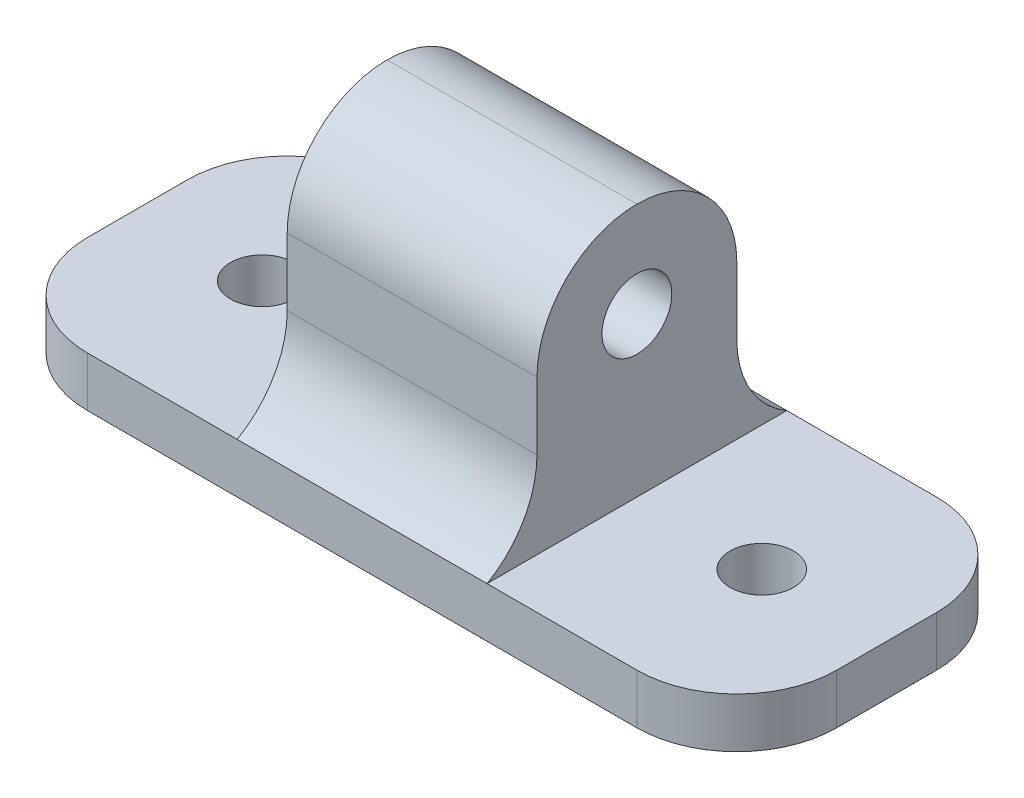
ISO-10303-21;
HEADER;
FILE_DESCRIPTION(('STEP AP214'),'2;1');
FILE_NAME('part.step','',(''),(''),'','','');
FILE_SCHEMA(('AUTOMOTIVE_DESIGN { 1 0 10303 214 1 1 1 1 }'));
ENDSEC;
DATA;
#1=APPLICATION_CONTEXT('core data for automotive mechanical design processes');
#2=APPLICATION_PROTOCOL_DEFINITION('international standard','automotive_design',2000,#1);
#3=PRODUCT_CONTEXT('',#1,'mechanical');
#4=PRODUCT('Part','Part','',(#3));
#5=PRODUCT_RELATED_PRODUCT_CATEGORY('part','',(#4));
#6=PRODUCT_DEFINITION_FORMATION('','',#4);
#7=PRODUCT_DEFINITION_CONTEXT('part definition',#1,'design');
#8=PRODUCT_DEFINITION('design','',#6,#7);
#9=PRODUCT_DEFINITION_SHAPE('','',#8);
#10=(LENGTH_UNIT() NAMED_UNIT(*) SI_UNIT(.MILLI.,.METRE.));
#11=(NAMED_UNIT(*) PLANE_ANGLE_UNIT() SI_UNIT($,.RADIAN.));
#12=(NAMED_UNIT(*) SI_UNIT($,.STERADIAN.) SOLID_ANGLE_UNIT());
#13=UNCERTAINTY_MEASURE_WITH_UNIT(LENGTH_MEASURE(1.E-05),#10,'distance_accuracy_value','');
#14=(GEOMETRIC_REPRESENTATION_CONTEXT(3) GLOBAL_UNCERTAINTY_ASSIGNED_CONTEXT((#13)) GLOBAL_UNIT_ASSIGNED_CONTEXT((#10,
#11,#12)) REPRESENTATION_CONTEXT('',''));
#15=CARTESIAN_POINT('',(0.,0.,0.));
#16=DIRECTION('',(0.,0.,1.));
#17=DIRECTION('',(1.,0.,0.));
#18=AXIS2_PLACEMENT_3D('',#15,#16,#17);
#19=CARTESIAN_POINT('',(0.,5.,0.));
#20=DIRECTION('',(0.,-1.,0.));
#21=DIRECTION('',(0.,0.,-1.));
#22=AXIS2_PLACEMENT_3D('',#19,#20,#21);
#23=PLANE('',#22);
#24=CARTESIAN_POINT('',(25.,5.,0.));
#25=DIRECTION('',(0.,1.,0.));
#26=DIRECTION('',(0.,0.,1.));
#27=AXIS2_PLACEMENT_3D('',#24,#25,#26);
#28=CIRCLE('',#27,3.17499999999999);
#29=CARTESIAN_POINT('',(25.,5.,3.17499999999999));
#30=VERTEX_POINT('',#29);
#31=EDGE_CURVE('E281',#30,#30,#28,.T.);
#32=ORIENTED_EDGE('',*,*,#31,.F.);
#33=EDGE_LOOP('',(#32));
#34=FACE_BOUND('',#33,.T.);
#35=DIRECTION('',(0.,0.,-1.));
#36=VECTOR('',#35,1.);
#37=CARTESIAN_POINT('',(12.5,5.,10.));
#38=LINE('',#37,#36);
#39=CARTESIAN_POINT('',(12.5,5.,15.));
#40=VERTEX_POINT('',#39);
#41=CARTESIAN_POINT('',(12.5,5.,-15.));
#42=VERTEX_POINT('',#41);
#43=EDGE_CURVE('E181',#40,#42,#38,.T.);
#44=ORIENTED_EDGE('',*,*,#43,.F.);
#45=DIRECTION('',(1.,0.,0.));
#46=VECTOR('',#45,1.);
#47=CARTESIAN_POINT('',(-37.5,5.,15.));
#48=LINE('',#47,#46);
#49=CARTESIAN_POINT('',(27.5,5.,15.));
#50=VERTEX_POINT('',#49);
#51=EDGE_CURVE('E255',#40,#50,#48,.T.);
#52=ORIENTED_EDGE('',*,*,#51,.T.);
#53=CARTESIAN_POINT('',(27.5,5.,5.));
#54=DIRECTION('',(0.,-1.,0.));
#55=DIRECTION('',(0.,0.,-1.));
#56=AXIS2_PLACEMENT_3D('',#53,#54,#55);
#57=CIRCLE('',#56,10.);
#58=CARTESIAN_POINT('',(37.5,5.,5.));
#59=VERTEX_POINT('',#58);
#60=EDGE_CURVE('E194',#50,#59,#57,.F.);
#61=ORIENTED_EDGE('',*,*,#60,.T.);
#62=DIRECTION('',(0.,0.,-1.));
#63=VECTOR('',#62,1.);
#64=CARTESIAN_POINT('',(37.5,5.,15.));
#65=LINE('',#64,#63);
#66=CARTESIAN_POINT('',(37.5,5.,-5.));
#67=VERTEX_POINT('',#66);
#68=EDGE_CURVE('E172',#59,#67,#65,.T.);
#69=ORIENTED_EDGE('',*,*,#68,.T.);
#70=CARTESIAN_POINT('',(27.5,5.,-5.));
#71=DIRECTION('',(0.,-1.,0.));
#72=DIRECTION('',(0.,0.,-1.));
#73=AXIS2_PLACEMENT_3D('',#70,#71,#72);
#74=CIRCLE('',#73,10.);
#75=CARTESIAN_POINT('',(27.5,5.,-15.));
#76=VERTEX_POINT('',#75);
#77=EDGE_CURVE('E192',#67,#76,#74,.F.);
#78=ORIENTED_EDGE('',*,*,#77,.T.);
#79=DIRECTION('',(-1.,0.,0.));
#80=VECTOR('',#79,1.);
#81=CARTESIAN_POINT('',(-37.5,5.,-15.));
#82=LINE('',#81,#80);
#83=EDGE_CURVE('E248',#76,#42,#82,.T.);
#84=ORIENTED_EDGE('',*,*,#83,.T.);
#85=EDGE_LOOP('',(#44,#52,#61,#69,#78,#84));
#86=FACE_BOUND('',#85,.T.);
#87=ADVANCED_FACE('F33',(#34,#86),#23,.F.);
#88=CARTESIAN_POINT('',(-25.,5.,0.));
#89=DIRECTION('',(0.,1.,0.));
#90=DIRECTION('',(0.,0.,1.));
#91=AXIS2_PLACEMENT_3D('',#88,#89,#90);
#92=CIRCLE('',#91,3.17499999999999);
#93=CARTESIAN_POINT('',(-25.,5.,3.17499999999999));
#94=VERTEX_POINT('',#93);
#95=EDGE_CURVE('E287',#94,#94,#92,.T.);
#96=ORIENTED_EDGE('',*,*,#95,.F.);
#97=EDGE_LOOP('',(#96));
#98=FACE_BOUND('',#97,.T.);
#99=CARTESIAN_POINT('',(-12.5,5.,-15.));
#100=VERTEX_POINT('',#99);
#101=CARTESIAN_POINT('',(-27.5,5.,-15.));
#102=VERTEX_POINT('',#101);
#103=EDGE_CURVE('E241',#100,#102,#82,.T.);
#104=ORIENTED_EDGE('',*,*,#103,.T.);
#105=CARTESIAN_POINT('',(-27.5,5.,-5.));
#106=DIRECTION('',(0.,-1.,0.));
#107=DIRECTION('',(0.,0.,-1.));
#108=AXIS2_PLACEMENT_3D('',#105,#106,#107);
#109=CIRCLE('',#108,10.);
#110=CARTESIAN_POINT('',(-37.5,5.,-5.));
#111=VERTEX_POINT('',#110);
#112=EDGE_CURVE('E198',#102,#111,#109,.F.);
#113=ORIENTED_EDGE('',*,*,#112,.T.);
#114=DIRECTION('',(0.,0.,1.));
#115=VECTOR('',#114,1.);
#116=CARTESIAN_POINT('',(-37.5,5.,15.));
#117=LINE('',#116,#115);
#118=CARTESIAN_POINT('',(-37.5,5.,5.));
#119=VERTEX_POINT('',#118);
#120=EDGE_CURVE('E162',#111,#119,#117,.T.);
#121=ORIENTED_EDGE('',*,*,#120,.T.);
#122=CARTESIAN_POINT('',(-27.5,5.,5.));
#123=DIRECTION('',(0.,-1.,0.));
#124=DIRECTION('',(0.,0.,-1.));
#125=AXIS2_PLACEMENT_3D('',#122,#123,#124);
#126=CIRCLE('',#125,10.);
#127=CARTESIAN_POINT('',(-27.5,5.,15.));
#128=VERTEX_POINT('',#127);
#129=EDGE_CURVE('E196',#119,#128,#126,.F.);
#130=ORIENTED_EDGE('',*,*,#129,.T.);
#131=CARTESIAN_POINT('',(-12.5,5.,15.));
#132=VERTEX_POINT('',#131);
#133=EDGE_CURVE('E183',#128,#132,#48,.T.);
#134=ORIENTED_EDGE('',*,*,#133,.T.);
#135=DIRECTION('',(0.,0.,1.));
#136=VECTOR('',#135,1.);
#137=CARTESIAN_POINT('',(-12.5,5.,10.));
#138=LINE('',#137,#136);
#139=EDGE_CURVE('E235',#100,#132,#138,.T.);
#140=ORIENTED_EDGE('',*,*,#139,.F.);
#141=EDGE_LOOP('',(#104,#113,#121,#130,#134,#140));
#142=FACE_BOUND('',#141,.T.);
#143=ADVANCED_FACE('F322',(#98,#142),#23,.F.);
#144=CARTESIAN_POINT('',(37.5,5.,15.));
#145=DIRECTION('',(-1.,0.,0.));
#146=DIRECTION('',(0.,0.,1.));
#147=AXIS2_PLACEMENT_3D('',#144,#145,#146);
#148=PLANE('',#147);
#149=ORIENTED_EDGE('',*,*,#68,.F.);
#150=DIRECTION('',(0.,-1.,0.));
#151=VECTOR('',#150,1.);
#152=CARTESIAN_POINT('',(37.5,5.,5.));
#153=LINE('',#152,#151);
#154=CARTESIAN_POINT('',(37.5,0.,5.));
#155=VERTEX_POINT('',#154);
#156=EDGE_CURVE('E224',#59,#155,#153,.T.);
#157=ORIENTED_EDGE('',*,*,#156,.T.);
#158=DIRECTION('',(0.,0.,-1.));
#159=VECTOR('',#158,1.);
#160=CARTESIAN_POINT('',(37.5,0.,15.));
#161=LINE('',#160,#159);
#162=CARTESIAN_POINT('',(37.5,0.,-5.));
#163=VERTEX_POINT('',#162);
#164=EDGE_CURVE('E174',#155,#163,#161,.T.);
#165=ORIENTED_EDGE('',*,*,#164,.T.);
#166=DIRECTION('',(0.,-1.,0.));
#167=VECTOR('',#166,1.);
#168=CARTESIAN_POINT('',(37.5,5.,-5.));
#169=LINE('',#168,#167);
#170=EDGE_CURVE('E222',#163,#67,#169,.F.);
#171=ORIENTED_EDGE('',*,*,#170,.T.);
#172=EDGE_LOOP('',(#149,#157,#165,#171));
#173=FACE_BOUND('',#172,.T.);
#174=ADVANCED_FACE('F320',(#173),#148,.F.);
#175=CARTESIAN_POINT('',(-37.5,5.,-15.));
#176=DIRECTION('',(0.,0.,1.));
#177=DIRECTION('',(1.,0.,0.));
#178=AXIS2_PLACEMENT_3D('',#175,#176,#177);
#179=PLANE('',#178);
#180=DIRECTION('',(-1.,0.,0.));
#181=VECTOR('',#180,1.);
#182=CARTESIAN_POINT('',(-37.5,0.,-15.));
#183=LINE('',#182,#181);
#184=CARTESIAN_POINT('',(27.5,0.,-15.));
#185=VERTEX_POINT('',#184);
#186=CARTESIAN_POINT('',(-27.5,0.,-15.));
#187=VERTEX_POINT('',#186);
#188=EDGE_CURVE('E169',#185,#187,#183,.T.);
#189=ORIENTED_EDGE('',*,*,#188,.T.);
#190=DIRECTION('',(0.,-1.,0.));
#191=VECTOR('',#190,1.);
#192=CARTESIAN_POINT('',(-27.5,5.,-15.));
#193=LINE('',#192,#191);
#194=EDGE_CURVE('E147',#187,#102,#193,.F.);
#195=ORIENTED_EDGE('',*,*,#194,.T.);
#196=ORIENTED_EDGE('',*,*,#103,.F.);
#197=EDGE_CURVE('E244',#42,#100,#82,.T.);
#198=ORIENTED_EDGE('',*,*,#197,.F.);
#199=ORIENTED_EDGE('',*,*,#83,.F.);
#200=DIRECTION('',(0.,-1.,0.));
#201=VECTOR('',#200,1.);
#202=CARTESIAN_POINT('',(27.5,5.,-15.));
#203=LINE('',#202,#201);
#204=EDGE_CURVE('E152',#76,#185,#203,.T.);
#205=ORIENTED_EDGE('',*,*,#204,.T.);
#206=EDGE_LOOP('',(#189,#195,#196,#198,#199,#205));
#207=FACE_BOUND('',#206,.T.);
#208=ADVANCED_FACE('F242',(#207),#179,.F.);
#209=CARTESIAN_POINT('',(-37.5,5.,15.));
#210=DIRECTION('',(1.,0.,0.));
#211=DIRECTION('',(0.,0.,-1.));
#212=AXIS2_PLACEMENT_3D('',#209,#210,#211);
#213=PLANE('',#212);
#214=ORIENTED_EDGE('',*,*,#120,.F.);
#215=DIRECTION('',(0.,-1.,0.));
#216=VECTOR('',#215,1.);
#217=CARTESIAN_POINT('',(-37.5,5.,-5.));
#218=LINE('',#217,#216);
#219=CARTESIAN_POINT('',(-37.5,0.,-5.));
#220=VERTEX_POINT('',#219);
#221=EDGE_CURVE('E146',#111,#220,#218,.T.);
#222=ORIENTED_EDGE('',*,*,#221,.T.);
#223=DIRECTION('',(0.,0.,1.));
#224=VECTOR('',#223,1.);
#225=CARTESIAN_POINT('',(-37.5,0.,15.));
#226=LINE('',#225,#224);
#227=CARTESIAN_POINT('',(-37.5,0.,5.));
#228=VERTEX_POINT('',#227);
#229=EDGE_CURVE('E159',#220,#228,#226,.T.);
#230=ORIENTED_EDGE('',*,*,#229,.T.);
#231=DIRECTION('',(0.,-1.,0.));
#232=VECTOR('',#231,1.);
#233=CARTESIAN_POINT('',(-37.5,5.,5.));
#234=LINE('',#233,#232);
#235=EDGE_CURVE('E164',#228,#119,#234,.F.);
#236=ORIENTED_EDGE('',*,*,#235,.T.);
#237=EDGE_LOOP('',(#214,#222,#230,#236));
#238=FACE_BOUND('',#237,.T.);
#239=ADVANCED_FACE('F158',(#238),#213,.F.);
#240=CARTESIAN_POINT('',(-37.5,5.,15.));
#241=DIRECTION('',(0.,0.,-1.));
#242=DIRECTION('',(-1.,0.,0.));
#243=AXIS2_PLACEMENT_3D('',#240,#241,#242);
#244=PLANE('',#243);
#245=ORIENTED_EDGE('',*,*,#133,.F.);
#246=DIRECTION('',(0.,-1.,0.));
#247=VECTOR('',#246,1.);
#248=CARTESIAN_POINT('',(-27.5,5.,15.));
#249=LINE('',#248,#247);
#250=CARTESIAN_POINT('',(-27.5,0.,15.));
#251=VERTEX_POINT('',#250);
#252=EDGE_CURVE('E202',#128,#251,#249,.T.);
#253=ORIENTED_EDGE('',*,*,#252,.T.);
#254=DIRECTION('',(1.,0.,0.));
#255=VECTOR('',#254,1.);
#256=CARTESIAN_POINT('',(-37.5,0.,15.));
#257=LINE('',#256,#255);
#258=CARTESIAN_POINT('',(27.5,0.,15.));
#259=VERTEX_POINT('',#258);
#260=EDGE_CURVE('E168',#251,#259,#257,.T.);
#261=ORIENTED_EDGE('',*,*,#260,.T.);
#262=DIRECTION('',(0.,-1.,0.));
#263=VECTOR('',#262,1.);
#264=CARTESIAN_POINT('',(27.5,5.,15.));
#265=LINE('',#264,#263);
#266=EDGE_CURVE('E200',#259,#50,#265,.F.);
#267=ORIENTED_EDGE('',*,*,#266,.T.);
#268=ORIENTED_EDGE('',*,*,#51,.F.);
#269=EDGE_CURVE('E257',#132,#40,#48,.T.);
#270=ORIENTED_EDGE('',*,*,#269,.F.);
#271=EDGE_LOOP('',(#245,#253,#261,#267,#268,#270));
#272=FACE_BOUND('',#271,.T.);
#273=ADVANCED_FACE('F316',(#272),#244,.F.);
#274=CARTESIAN_POINT('',(0.,0.,0.));
#275=DIRECTION('',(0.,-1.,0.));
#276=DIRECTION('',(0.,0.,-1.));
#277=AXIS2_PLACEMENT_3D('',#274,#275,#276);
#278=PLANE('',#277);
#279=CARTESIAN_POINT('',(-25.,0.,0.));
#280=DIRECTION('',(0.,-1.,0.));
#281=DIRECTION('',(0.,0.,-1.));
#282=AXIS2_PLACEMENT_3D('',#279,#280,#281);
#283=CIRCLE('',#282,3.17499999999999);
#284=CARTESIAN_POINT('',(-25.,0.,-3.17499999999999));
#285=VERTEX_POINT('',#284);
#286=EDGE_CURVE('E284',#285,#285,#283,.T.);
#287=ORIENTED_EDGE('',*,*,#286,.F.);
#288=EDGE_LOOP('',(#287));
#289=FACE_BOUND('',#288,.T.);
#290=CARTESIAN_POINT('',(25.,0.,0.));
#291=DIRECTION('',(0.,-1.,0.));
#292=DIRECTION('',(0.,0.,-1.));
#293=AXIS2_PLACEMENT_3D('',#290,#291,#292);
#294=CIRCLE('',#293,3.17499999999999);
#295=CARTESIAN_POINT('',(25.,0.,-3.17499999999999));
#296=VERTEX_POINT('',#295);
#297=EDGE_CURVE('E278',#296,#296,#294,.T.);
#298=ORIENTED_EDGE('',*,*,#297,.F.);
#299=EDGE_LOOP('',(#298));
#300=FACE_BOUND('',#299,.T.);
#301=ORIENTED_EDGE('',*,*,#229,.F.);
#302=CARTESIAN_POINT('',(-27.5,0.,-5.));
#303=DIRECTION('',(0.,-1.,0.));
#304=DIRECTION('',(0.,0.,-1.));
#305=AXIS2_PLACEMENT_3D('',#302,#303,#304);
#306=CIRCLE('',#305,10.);
#307=EDGE_CURVE('E142',#220,#187,#306,.T.);
#308=ORIENTED_EDGE('',*,*,#307,.T.);
#309=ORIENTED_EDGE('',*,*,#188,.F.);
#310=CARTESIAN_POINT('',(27.5,0.,-5.));
#311=DIRECTION('',(0.,-1.,0.));
#312=DIRECTION('',(0.,0.,-1.));
#313=AXIS2_PLACEMENT_3D('',#310,#311,#312);
#314=CIRCLE('',#313,10.);
#315=EDGE_CURVE('E163',#185,#163,#314,.T.);
#316=ORIENTED_EDGE('',*,*,#315,.T.);
#317=ORIENTED_EDGE('',*,*,#164,.F.);
#318=CARTESIAN_POINT('',(27.5,0.,5.));
#319=DIRECTION('',(0.,-1.,0.));
#320=DIRECTION('',(0.,0.,-1.));
#321=AXIS2_PLACEMENT_3D('',#318,#319,#320);
#322=CIRCLE('',#321,10.);
#323=EDGE_CURVE('E186',#155,#259,#322,.T.);
#324=ORIENTED_EDGE('',*,*,#323,.T.);
#325=ORIENTED_EDGE('',*,*,#260,.F.);
#326=CARTESIAN_POINT('',(-27.5,0.,5.));
#327=DIRECTION('',(0.,-1.,0.));
#328=DIRECTION('',(0.,0.,-1.));
#329=AXIS2_PLACEMENT_3D('',#326,#327,#328);
#330=CIRCLE('',#329,10.);
#331=EDGE_CURVE('E153',#251,#228,#330,.T.);
#332=ORIENTED_EDGE('',*,*,#331,.T.);
#333=EDGE_LOOP('',(#301,#308,#309,#316,#317,#324,#325,#332));
#334=FACE_BOUND('',#333,.T.);
#335=ADVANCED_FACE('F166',(#289,#300,#334),#278,.T.);
#336=CARTESIAN_POINT('',(12.5,30.4,10.));
#337=DIRECTION('',(-1.,0.,0.));
#338=DIRECTION('',(0.,0.,1.));
#339=AXIS2_PLACEMENT_3D('',#336,#337,#338);
#340=PLANE('',#339);
#341=CARTESIAN_POINT('',(12.5,20.875,0.));
#342=DIRECTION('',(1.,0.,0.));
#343=DIRECTION('',(0.,0.,-1.));
#344=AXIS2_PLACEMENT_3D('',#341,#342,#343);
#345=CIRCLE('',#344,3.4925);
#346=CARTESIAN_POINT('',(12.5,20.875,-3.4925));
#347=VERTEX_POINT('',#346);
#348=EDGE_CURVE('E182',#347,#347,#345,.T.);
#349=ORIENTED_EDGE('',*,*,#348,.F.);
#350=EDGE_LOOP('',(#349));
#351=FACE_BOUND('',#350,.T.);
#352=CARTESIAN_POINT('',(12.5,20.4,0.));
#353=DIRECTION('',(-1.,0.,0.));
#354=DIRECTION('',(0.,0.,1.));
#355=AXIS2_PLACEMENT_3D('',#352,#353,#354);
#356=CIRCLE('',#355,10.);
#357=CARTESIAN_POINT('',(12.5,20.4,-10.));
#358=VERTEX_POINT('',#357);
#359=CARTESIAN_POINT('',(12.5,30.4,0.));
#360=VERTEX_POINT('',#359);
#361=EDGE_CURVE('E211',#358,#360,#356,.F.);
#362=ORIENTED_EDGE('',*,*,#361,.T.);
#363=CARTESIAN_POINT('',(12.5,20.4,0.));
#364=DIRECTION('',(-1.,0.,0.));
#365=DIRECTION('',(0.,0.,1.));
#366=AXIS2_PLACEMENT_3D('',#363,#364,#365);
#367=CIRCLE('',#366,10.);
#368=CARTESIAN_POINT('',(12.5,20.4,10.));
#369=VERTEX_POINT('',#368);
#370=EDGE_CURVE('E213',#360,#369,#367,.F.);
#371=ORIENTED_EDGE('',*,*,#370,.T.);
#372=DIRECTION('',(0.,-1.,0.));
#373=VECTOR('',#372,1.);
#374=CARTESIAN_POINT('',(12.5,30.4,10.));
#375=LINE('',#374,#373);
#376=CARTESIAN_POINT('',(12.5,13.6602540378444,10.));
#377=VERTEX_POINT('',#376);
#378=EDGE_CURVE('E271',#369,#377,#375,.T.);
#379=ORIENTED_EDGE('',*,*,#378,.T.);
#380=CARTESIAN_POINT('',(12.5,13.6602540378444,20.));
#381=DIRECTION('',(-1.,0.,0.));
#382=DIRECTION('',(0.,0.,1.));
#383=AXIS2_PLACEMENT_3D('',#380,#381,#382);
#384=CIRCLE('',#383,10.);
#385=EDGE_CURVE('E227',#377,#40,#384,.T.);
#386=ORIENTED_EDGE('',*,*,#385,.T.);
#387=ORIENTED_EDGE('',*,*,#43,.T.);
#388=CARTESIAN_POINT('',(12.5,13.6602540378444,-20.));
#389=DIRECTION('',(-1.,0.,0.));
#390=DIRECTION('',(0.,0.,1.));
#391=AXIS2_PLACEMENT_3D('',#388,#389,#390);
#392=CIRCLE('',#391,10.);
#393=CARTESIAN_POINT('',(12.5,13.6602540378444,-10.));
#394=VERTEX_POINT('',#393);
#395=EDGE_CURVE('E11',#42,#394,#392,.T.);
#396=ORIENTED_EDGE('',*,*,#395,.T.);
#397=DIRECTION('',(0.,-1.,0.));
#398=VECTOR('',#397,1.);
#399=CARTESIAN_POINT('',(12.5,30.4,-10.));
#400=LINE('',#399,#398);
#401=EDGE_CURVE('E259',#358,#394,#400,.T.);
#402=ORIENTED_EDGE('',*,*,#401,.F.);
#403=EDGE_LOOP('',(#362,#371,#379,#386,#387,#396,#402));
#404=FACE_BOUND('',#403,.T.);
#405=ADVANCED_FACE('F303',(#351,#404),#340,.F.);
#406=CARTESIAN_POINT('',(-12.5,30.4,-10.));
#407=DIRECTION('',(0.,0.,1.));
#408=DIRECTION('',(1.,0.,0.));
#409=AXIS2_PLACEMENT_3D('',#406,#407,#408);
#410=PLANE('',#409);
#411=DIRECTION('',(0.,-1.,0.));
#412=VECTOR('',#411,1.);
#413=CARTESIAN_POINT('',(-12.5,30.4,-10.));
#414=LINE('',#413,#412);
#415=CARTESIAN_POINT('',(-12.5,20.4,-10.));
#416=VERTEX_POINT('',#415);
#417=CARTESIAN_POINT('',(-12.5,13.6602540378444,-10.));
#418=VERTEX_POINT('',#417);
#419=EDGE_CURVE('E237',#416,#418,#414,.T.);
#420=ORIENTED_EDGE('',*,*,#419,.F.);
#421=DIRECTION('',(-1.,0.,0.));
#422=VECTOR('',#421,1.);
#423=CARTESIAN_POINT('',(-12.5,20.4,-10.));
#424=LINE('',#423,#422);
#425=EDGE_CURVE('E220',#416,#358,#424,.F.);
#426=ORIENTED_EDGE('',*,*,#425,.T.);
#427=ORIENTED_EDGE('',*,*,#401,.T.);
#428=DIRECTION('',(-1.,0.,0.));
#429=VECTOR('',#428,1.);
#430=CARTESIAN_POINT('',(-12.5,13.6602540378444,-10.));
#431=LINE('',#430,#429);
#432=EDGE_CURVE('E218',#394,#418,#431,.T.);
#433=ORIENTED_EDGE('',*,*,#432,.T.);
#434=EDGE_LOOP('',(#420,#426,#427,#433));
#435=FACE_BOUND('',#434,.T.);
#436=ADVANCED_FACE('F301',(#435),#410,.F.);
#437=CARTESIAN_POINT('',(-12.5,30.4,10.));
#438=DIRECTION('',(1.,0.,0.));
#439=DIRECTION('',(0.,0.,-1.));
#440=AXIS2_PLACEMENT_3D('',#437,#438,#439);
#441=PLANE('',#440);
#442=CARTESIAN_POINT('',(-12.5,20.875,0.));
#443=DIRECTION('',(1.,0.,0.));
#444=DIRECTION('',(0.,0.,-1.));
#445=AXIS2_PLACEMENT_3D('',#442,#443,#444);
#446=CIRCLE('',#445,3.4925);
#447=CARTESIAN_POINT('',(-12.5,20.875,-3.4925));
#448=VERTEX_POINT('',#447);
#449=EDGE_CURVE('E178',#448,#448,#446,.T.);
#450=ORIENTED_EDGE('',*,*,#449,.T.);
#451=EDGE_LOOP('',(#450));
#452=FACE_BOUND('',#451,.T.);
#453=DIRECTION('',(0.,-1.,0.));
#454=VECTOR('',#453,1.);
#455=CARTESIAN_POINT('',(-12.5,30.4,10.));
#456=LINE('',#455,#454);
#457=CARTESIAN_POINT('',(-12.5,20.4,10.));
#458=VERTEX_POINT('',#457);
#459=CARTESIAN_POINT('',(-12.5,13.6602540378444,10.));
#460=VERTEX_POINT('',#459);
#461=EDGE_CURVE('E266',#458,#460,#456,.T.);
#462=ORIENTED_EDGE('',*,*,#461,.F.);
#463=CARTESIAN_POINT('',(-12.5,20.4,0.));
#464=DIRECTION('',(1.,0.,0.));
#465=DIRECTION('',(0.,0.,-1.));
#466=AXIS2_PLACEMENT_3D('',#463,#464,#465);
#467=CIRCLE('',#466,10.);
#468=CARTESIAN_POINT('',(-12.5,30.4,0.));
#469=VERTEX_POINT('',#468);
#470=EDGE_CURVE('E216',#458,#469,#467,.F.);
#471=ORIENTED_EDGE('',*,*,#470,.T.);
#472=CARTESIAN_POINT('',(-12.5,20.4,0.));
#473=DIRECTION('',(1.,0.,0.));
#474=DIRECTION('',(0.,0.,-1.));
#475=AXIS2_PLACEMENT_3D('',#472,#473,#474);
#476=CIRCLE('',#475,10.);
#477=EDGE_CURVE('E56',#469,#416,#476,.F.);
#478=ORIENTED_EDGE('',*,*,#477,.T.);
#479=ORIENTED_EDGE('',*,*,#419,.T.);
#480=CARTESIAN_POINT('',(-12.5,13.6602540378444,-20.));
#481=DIRECTION('',(1.,0.,0.));
#482=DIRECTION('',(0.,0.,-1.));
#483=AXIS2_PLACEMENT_3D('',#480,#481,#482);
#484=CIRCLE('',#483,10.);
#485=EDGE_CURVE('E42',#418,#100,#484,.T.);
#486=ORIENTED_EDGE('',*,*,#485,.T.);
#487=ORIENTED_EDGE('',*,*,#139,.T.);
#488=CARTESIAN_POINT('',(-12.5,13.6602540378444,20.));
#489=DIRECTION('',(1.,0.,0.));
#490=DIRECTION('',(0.,0.,-1.));
#491=AXIS2_PLACEMENT_3D('',#488,#489,#490);
#492=CIRCLE('',#491,10.);
#493=EDGE_CURVE('E230',#132,#460,#492,.T.);
#494=ORIENTED_EDGE('',*,*,#493,.T.);
#495=EDGE_LOOP('',(#462,#471,#478,#479,#486,#487,#494));
#496=FACE_BOUND('',#495,.T.);
#497=ADVANCED_FACE('F234',(#452,#496),#441,.F.);
#498=CARTESIAN_POINT('',(-12.5,30.4,10.));
#499=DIRECTION('',(0.,0.,-1.));
#500=DIRECTION('',(-1.,0.,0.));
#501=AXIS2_PLACEMENT_3D('',#498,#499,#500);
#502=PLANE('',#501);
#503=ORIENTED_EDGE('',*,*,#461,.T.);
#504=DIRECTION('',(1.,0.,0.));
#505=VECTOR('',#504,1.);
#506=CARTESIAN_POINT('',(-12.5,13.6602540378444,10.));
#507=LINE('',#506,#505);
#508=EDGE_CURVE('E208',#460,#377,#507,.T.);
#509=ORIENTED_EDGE('',*,*,#508,.T.);
#510=ORIENTED_EDGE('',*,*,#378,.F.);
#511=DIRECTION('',(1.,0.,0.));
#512=VECTOR('',#511,1.);
#513=CARTESIAN_POINT('',(-12.5,20.4,10.));
#514=LINE('',#513,#512);
#515=EDGE_CURVE('E205',#369,#458,#514,.F.);
#516=ORIENTED_EDGE('',*,*,#515,.T.);
#517=EDGE_LOOP('',(#503,#509,#510,#516));
#518=FACE_BOUND('',#517,.T.);
#519=ADVANCED_FACE('F375',(#518),#502,.F.);
#520=CARTESIAN_POINT('',(-37.5,20.875,0.));
#521=DIRECTION('',(1.,0.,0.));
#522=DIRECTION('',(0.,0.,-1.));
#523=AXIS2_PLACEMENT_3D('',#520,#521,#522);
#524=CYLINDRICAL_SURFACE('',#523,3.4925);
#525=CARTESIAN_POINT('',(12.5,20.875,-3.4925));
#526=CARTESIAN_POINT('',(12.2395833333333,20.875,-3.4925));
#527=CARTESIAN_POINT('',(11.9791666666667,20.875,-3.4925));
#528=CARTESIAN_POINT('',(11.4583333333333,20.875,-3.4925));
#529=CARTESIAN_POINT('',(11.1979166666667,20.875,-3.4925));
#530=CARTESIAN_POINT('',(10.6770833333333,20.875,-3.4925));
#531=CARTESIAN_POINT('',(10.4166666666667,20.875,-3.4925));
#532=CARTESIAN_POINT('',(9.89583333333334,20.875,-3.4925));
#533=CARTESIAN_POINT('',(9.63541666666667,20.875,-3.4925));
#534=CARTESIAN_POINT('',(9.11458333333334,20.875,-3.4925));
#535=CARTESIAN_POINT('',(8.85416666666667,20.875,-3.4925));
#536=CARTESIAN_POINT('',(8.33333333333334,20.875,-3.4925));
#537=CARTESIAN_POINT('',(8.07291666666667,20.875,-3.4925));
#538=CARTESIAN_POINT('',(7.55208333333333,20.875,-3.4925));
#539=CARTESIAN_POINT('',(7.29166666666667,20.875,-3.4925));
#540=CARTESIAN_POINT('',(6.77083333333333,20.875,-3.4925));
#541=CARTESIAN_POINT('',(6.51041666666667,20.875,-3.4925));
#542=CARTESIAN_POINT('',(5.98958333333333,20.875,-3.4925));
#543=CARTESIAN_POINT('',(5.72916666666667,20.875,-3.4925));
#544=CARTESIAN_POINT('',(5.20833333333334,20.875,-3.4925));
#545=CARTESIAN_POINT('',(4.94791666666667,20.875,-3.4925));
#546=CARTESIAN_POINT('',(4.42708333333334,20.875,-3.4925));
#547=CARTESIAN_POINT('',(4.16666666666667,20.875,-3.4925));
#548=CARTESIAN_POINT('',(3.64583333333333,20.875,-3.4925));
#549=CARTESIAN_POINT('',(3.38541666666667,20.875,-3.4925));
#550=CARTESIAN_POINT('',(2.86458333333333,20.875,-3.4925));
#551=CARTESIAN_POINT('',(2.60416666666667,20.875,-3.4925));
#552=CARTESIAN_POINT('',(2.08333333333333,20.875,-3.4925));
#553=CARTESIAN_POINT('',(1.82291666666667,20.875,-3.4925));
#554=CARTESIAN_POINT('',(1.30208333333334,20.875,-3.4925));
#555=CARTESIAN_POINT('',(1.04166666666667,20.875,-3.4925));
#556=CARTESIAN_POINT('',(0.520833333333336,20.875,-3.4925));
#557=CARTESIAN_POINT('',(0.260416666666668,20.875,-3.4925));
#558=CARTESIAN_POINT('',(-0.260416666666668,20.875,-3.4925));
#559=CARTESIAN_POINT('',(-0.520833333333336,20.875,-3.4925));
#560=CARTESIAN_POINT('',(-1.04166666666667,20.875,-3.4925));
#561=CARTESIAN_POINT('',(-1.30208333333334,20.875,-3.4925));
#562=CARTESIAN_POINT('',(-1.82291666666667,20.875,-3.4925));
#563=CARTESIAN_POINT('',(-2.08333333333333,20.875,-3.4925));
#564=CARTESIAN_POINT('',(-2.60416666666667,20.875,-3.4925));
#565=CARTESIAN_POINT('',(-2.86458333333333,20.875,-3.4925));
#566=CARTESIAN_POINT('',(-3.38541666666667,20.875,-3.4925));
#567=CARTESIAN_POINT('',(-3.64583333333333,20.875,-3.4925));
#568=CARTESIAN_POINT('',(-4.16666666666667,20.875,-3.4925));
#569=CARTESIAN_POINT('',(-4.42708333333334,20.875,-3.4925));
#570=CARTESIAN_POINT('',(-4.94791666666667,20.875,-3.4925));
#571=CARTESIAN_POINT('',(-5.20833333333334,20.875,-3.4925));
#572=CARTESIAN_POINT('',(-5.72916666666667,20.875,-3.4925));
#573=CARTESIAN_POINT('',(-5.98958333333333,20.875,-3.4925));
#574=CARTESIAN_POINT('',(-6.51041666666667,20.875,-3.4925));
#575=CARTESIAN_POINT('',(-6.77083333333333,20.875,-3.4925));
#576=CARTESIAN_POINT('',(-7.29166666666667,20.875,-3.4925));
#577=CARTESIAN_POINT('',(-7.55208333333333,20.875,-3.4925));
#578=CARTESIAN_POINT('',(-8.07291666666667,20.875,-3.4925));
#579=CARTESIAN_POINT('',(-8.33333333333333,20.875,-3.4925));
#580=CARTESIAN_POINT('',(-8.85416666666667,20.875,-3.4925));
#581=CARTESIAN_POINT('',(-9.11458333333333,20.875,-3.4925));
#582=CARTESIAN_POINT('',(-9.63541666666667,20.875,-3.4925));
#583=CARTESIAN_POINT('',(-9.89583333333333,20.875,-3.4925));
#584=CARTESIAN_POINT('',(-10.4166666666667,20.875,-3.4925));
#585=CARTESIAN_POINT('',(-10.6770833333333,20.875,-3.4925));
#586=CARTESIAN_POINT('',(-11.1979166666667,20.875,-3.4925));
#587=CARTESIAN_POINT('',(-11.4583333333333,20.875,-3.4925));
#588=CARTESIAN_POINT('',(-11.9791666666667,20.875,-3.4925));
#589=CARTESIAN_POINT('',(-12.2395833333333,20.875,-3.4925));
#590=CARTESIAN_POINT('',(-12.5,20.875,-3.4925));
#591=B_SPLINE_CURVE_WITH_KNOTS('',3,(#525,#526,#527,#528,#529,#530,#531,#532,#533,#534,#535,
#536,#537,#538,#539,#540,#541,#542,#543,#544,#545,#546,#547,#548,#549,#550,#551,#552,#553,#554,
#555,#556,#557,#558,#559,#560,#561,#562,#563,#564,#565,#566,#567,#568,#569,#570,#571,#572,#573,
#574,#575,#576,#577,#578,#579,#580,#581,#582,#583,#584,#585,#586,#587,#588,#589,#590),
.UNSPECIFIED.,.F.,.F.,(4,2,2,2,2,2,2,2,2,2,2,2,2,2,2,2,2,2,2,2,2,2,2,2,2,2,2,2,2,2,2,2,4),(0.,
0.781249999999997,1.5625,2.34375,3.125,3.90625,4.6875,5.46875,6.25000000000001,7.03125,7.8125,
8.59375,9.375,10.15625,10.9375,11.71875,12.5,13.28125,14.0625,14.84375,15.625,16.40625,17.1875,
17.96875,18.75,19.53125,20.3125,21.09375,21.875,22.65625,23.4375,24.21875,25.),.UNSPECIFIED.);
#592=EDGE_CURVE('BSEAM383',#347,#448,#591,.T.);
#593=ORIENTED_EDGE('',*,*,#348,.T.);
#594=ORIENTED_EDGE('',*,*,#449,.F.);
#595=ORIENTED_EDGE('',*,*,#592,.T.);
#596=ORIENTED_EDGE('',*,*,#592,.F.);
#597=EDGE_LOOP('',(#593,#595,#594,#596));
#598=FACE_BOUND('',#597,.T.);
#599=ADVANCED_FACE('F383',(#598),#524,.F.);
#600=CARTESIAN_POINT('',(25.,5.,0.));
#601=DIRECTION('',(0.,1.,0.));
#602=DIRECTION('',(0.,0.,1.));
#603=AXIS2_PLACEMENT_3D('',#600,#601,#602);
#604=CYLINDRICAL_SURFACE('',#603,3.17499999999999);
#605=ORIENTED_EDGE('',*,*,#31,.T.);
#606=EDGE_LOOP('',(#605));
#607=FACE_BOUND('',#606,.T.);
#608=ORIENTED_EDGE('',*,*,#297,.T.);
#609=EDGE_LOOP('',(#608));
#610=FACE_BOUND('',#609,.T.);
#611=ADVANCED_FACE('F392',(#607,#610),#604,.F.);
#612=CARTESIAN_POINT('',(-25.,5.,0.));
#613=DIRECTION('',(0.,1.,0.));
#614=DIRECTION('',(0.,0.,1.));
#615=AXIS2_PLACEMENT_3D('',#612,#613,#614);
#616=CYLINDRICAL_SURFACE('',#615,3.17499999999999);
#617=ORIENTED_EDGE('',*,*,#95,.T.);
#618=EDGE_LOOP('',(#617));
#619=FACE_BOUND('',#618,.T.);
#620=ORIENTED_EDGE('',*,*,#286,.T.);
#621=EDGE_LOOP('',(#620));
#622=FACE_BOUND('',#621,.T.);
#623=ADVANCED_FACE('F400',(#619,#622),#616,.F.);
#624=CARTESIAN_POINT('',(-27.5,5.,-5.));
#625=DIRECTION('',(0.,-1.,0.));
#626=DIRECTION('',(0.,0.,-1.));
#627=AXIS2_PLACEMENT_3D('',#624,#625,#626);
#628=CYLINDRICAL_SURFACE('',#627,10.);
#629=ORIENTED_EDGE('',*,*,#112,.F.);
#630=ORIENTED_EDGE('',*,*,#194,.F.);
#631=ORIENTED_EDGE('',*,*,#307,.F.);
#632=ORIENTED_EDGE('',*,*,#221,.F.);
#633=EDGE_LOOP('',(#629,#630,#631,#632));
#634=FACE_BOUND('',#633,.T.);
#635=ADVANCED_FACE('F145',(#634),#628,.T.);
#636=CARTESIAN_POINT('',(-27.5,5.,5.));
#637=DIRECTION('',(0.,-1.,0.));
#638=DIRECTION('',(0.,0.,-1.));
#639=AXIS2_PLACEMENT_3D('',#636,#637,#638);
#640=CYLINDRICAL_SURFACE('',#639,10.);
#641=ORIENTED_EDGE('',*,*,#129,.F.);
#642=ORIENTED_EDGE('',*,*,#235,.F.);
#643=ORIENTED_EDGE('',*,*,#331,.F.);
#644=ORIENTED_EDGE('',*,*,#252,.F.);
#645=EDGE_LOOP('',(#641,#642,#643,#644));
#646=FACE_BOUND('',#645,.T.);
#647=ADVANCED_FACE('F413',(#646),#640,.T.);
#648=CARTESIAN_POINT('',(0.,13.6602540378444,20.));
#649=DIRECTION('',(1.,0.,0.));
#650=DIRECTION('',(0.,0.,-1.));
#651=AXIS2_PLACEMENT_3D('',#648,#649,#650);
#652=CYLINDRICAL_SURFACE('',#651,10.);
#653=ORIENTED_EDGE('',*,*,#493,.F.);
#654=ORIENTED_EDGE('',*,*,#269,.T.);
#655=ORIENTED_EDGE('',*,*,#385,.F.);
#656=ORIENTED_EDGE('',*,*,#508,.F.);
#657=EDGE_LOOP('',(#653,#654,#655,#656));
#658=FACE_BOUND('',#657,.T.);
#659=ADVANCED_FACE('F419',(#658),#652,.F.);
#660=CARTESIAN_POINT('',(0.,20.4,0.));
#661=DIRECTION('',(-1.,0.,0.));
#662=DIRECTION('',(0.,0.,1.));
#663=AXIS2_PLACEMENT_3D('',#660,#661,#662);
#664=CYLINDRICAL_SURFACE('',#663,10.);
#665=ORIENTED_EDGE('',*,*,#425,.F.);
#666=ORIENTED_EDGE('',*,*,#477,.F.);
#667=DIRECTION('',(-1.,0.,0.));
#668=VECTOR('',#667,1.);
#669=CARTESIAN_POINT('',(0.,30.4,0.));
#670=LINE('',#669,#668);
#671=EDGE_CURVE('E37',#360,#469,#670,.T.);
#672=ORIENTED_EDGE('',*,*,#671,.F.);
#673=ORIENTED_EDGE('',*,*,#361,.F.);
#674=EDGE_LOOP('',(#665,#666,#672,#673));
#675=FACE_BOUND('',#674,.T.);
#676=ADVANCED_FACE('F300',(#675),#664,.T.);
#677=CARTESIAN_POINT('',(0.,20.4,0.));
#678=DIRECTION('',(1.,0.,0.));
#679=DIRECTION('',(0.,0.,-1.));
#680=AXIS2_PLACEMENT_3D('',#677,#678,#679);
#681=CYLINDRICAL_SURFACE('',#680,10.);
#682=ORIENTED_EDGE('',*,*,#470,.F.);
#683=ORIENTED_EDGE('',*,*,#515,.F.);
#684=ORIENTED_EDGE('',*,*,#370,.F.);
#685=ORIENTED_EDGE('',*,*,#671,.T.);
#686=EDGE_LOOP('',(#682,#683,#684,#685));
#687=FACE_BOUND('',#686,.T.);
#688=ADVANCED_FACE('F295',(#687),#681,.T.);
#689=CARTESIAN_POINT('',(0.,13.6602540378444,-20.));
#690=DIRECTION('',(-1.,0.,0.));
#691=DIRECTION('',(0.,0.,1.));
#692=AXIS2_PLACEMENT_3D('',#689,#690,#691);
#693=CYLINDRICAL_SURFACE('',#692,10.);
#694=ORIENTED_EDGE('',*,*,#395,.F.);
#695=ORIENTED_EDGE('',*,*,#197,.T.);
#696=ORIENTED_EDGE('',*,*,#485,.F.);
#697=ORIENTED_EDGE('',*,*,#432,.F.);
#698=EDGE_LOOP('',(#694,#695,#696,#697));
#699=FACE_BOUND('',#698,.T.);
#700=ADVANCED_FACE('F250',(#699),#693,.F.);
#701=CARTESIAN_POINT('',(27.5,5.,5.));
#702=DIRECTION('',(0.,-1.,0.));
#703=DIRECTION('',(0.,0.,-1.));
#704=AXIS2_PLACEMENT_3D('',#701,#702,#703);
#705=CYLINDRICAL_SURFACE('',#704,10.);
#706=ORIENTED_EDGE('',*,*,#60,.F.);
#707=ORIENTED_EDGE('',*,*,#266,.F.);
#708=ORIENTED_EDGE('',*,*,#323,.F.);
#709=ORIENTED_EDGE('',*,*,#156,.F.);
#710=EDGE_LOOP('',(#706,#707,#708,#709));
#711=FACE_BOUND('',#710,.T.);
#712=ADVANCED_FACE('F318',(#711),#705,.T.);
#713=CARTESIAN_POINT('',(27.5,5.,-5.));
#714=DIRECTION('',(0.,-1.,0.));
#715=DIRECTION('',(0.,0.,-1.));
#716=AXIS2_PLACEMENT_3D('',#713,#714,#715);
#717=CYLINDRICAL_SURFACE('',#716,10.);
#718=ORIENTED_EDGE('',*,*,#77,.F.);
#719=ORIENTED_EDGE('',*,*,#170,.F.);
#720=ORIENTED_EDGE('',*,*,#315,.F.);
#721=ORIENTED_EDGE('',*,*,#204,.F.);
#722=EDGE_LOOP('',(#718,#719,#720,#721));
#723=FACE_BOUND('',#722,.T.);
#724=ADVANCED_FACE('F35',(#723),#717,.T.);
#725=CLOSED_SHELL('',(#87,#143,#174,#208,#239,#273,#335,#405,#436,#497,#519,#599,#611,#623,#635,
#647,#659,#676,#688,#700,#712,#724));
#726=MANIFOLD_SOLID_BREP('B2',#725);
#727=ADVANCED_BREP_SHAPE_REPRESENTATION('',(#18,#726),#14);
#728=SHAPE_DEFINITION_REPRESENTATION(#9,#727);
ENDSEC;
END-ISO-10303-21;
